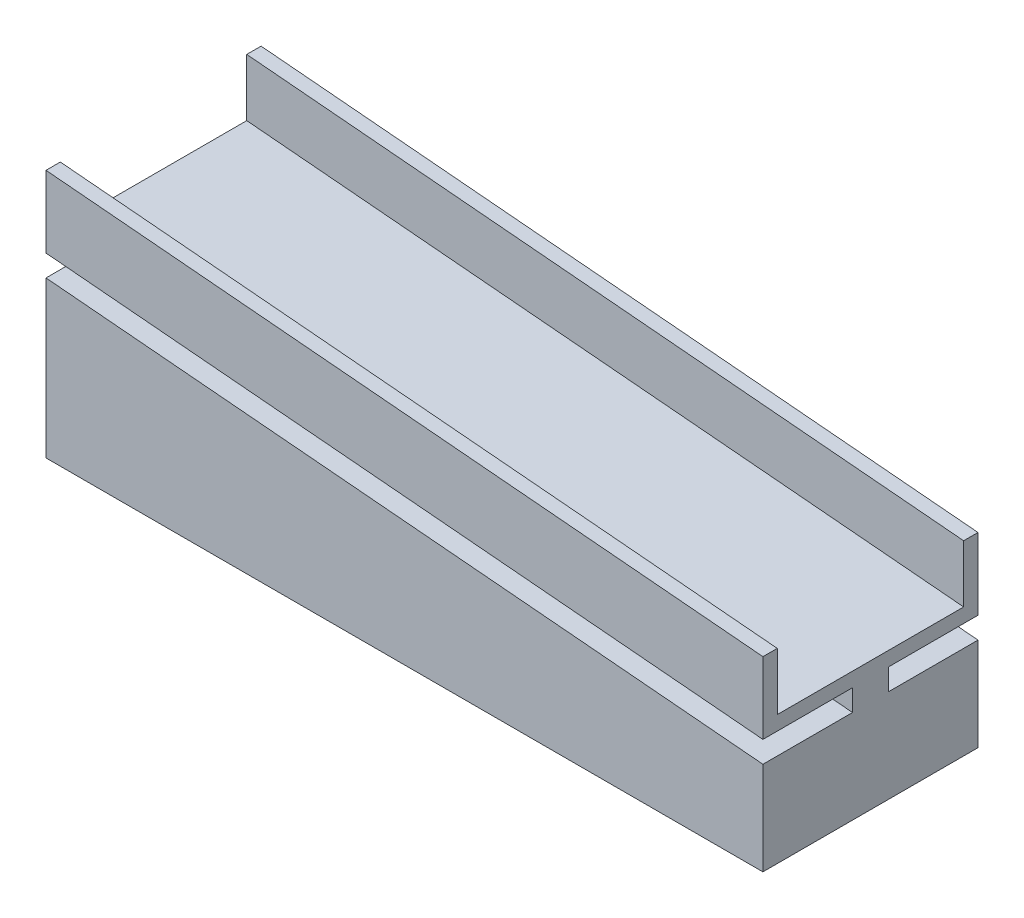
ISO-10303-21;
HEADER;
FILE_DESCRIPTION(('STEP AP214'),'2;1');
FILE_NAME('part.step','',(''),(''),'','','');
FILE_SCHEMA(('AUTOMOTIVE_DESIGN { 1 0 10303 214 1 1 1 1 }'));
ENDSEC;
DATA;
#1=APPLICATION_CONTEXT('core data for automotive mechanical design processes');
#2=APPLICATION_PROTOCOL_DEFINITION('international standard','automotive_design',2000,#1);
#3=PRODUCT_CONTEXT('',#1,'mechanical');
#4=PRODUCT('Part','Part','',(#3));
#5=PRODUCT_RELATED_PRODUCT_CATEGORY('part','',(#4));
#6=PRODUCT_DEFINITION_FORMATION('','',#4);
#7=PRODUCT_DEFINITION_CONTEXT('part definition',#1,'design');
#8=PRODUCT_DEFINITION('design','',#6,#7);
#9=PRODUCT_DEFINITION_SHAPE('','',#8);
#10=(LENGTH_UNIT() NAMED_UNIT(*) SI_UNIT(.MILLI.,.METRE.));
#11=(NAMED_UNIT(*) PLANE_ANGLE_UNIT() SI_UNIT($,.RADIAN.));
#12=(NAMED_UNIT(*) SI_UNIT($,.STERADIAN.) SOLID_ANGLE_UNIT());
#13=UNCERTAINTY_MEASURE_WITH_UNIT(LENGTH_MEASURE(1.E-05),#10,'distance_accuracy_value','');
#14=(GEOMETRIC_REPRESENTATION_CONTEXT(3) GLOBAL_UNCERTAINTY_ASSIGNED_CONTEXT((#13)) GLOBAL_UNIT_ASSIGNED_CONTEXT((#10,
#11,#12)) REPRESENTATION_CONTEXT('',''));
#15=CARTESIAN_POINT('',(0.,0.,0.));
#16=DIRECTION('',(0.,0.,1.));
#17=DIRECTION('',(1.,0.,0.));
#18=AXIS2_PLACEMENT_3D('',#15,#16,#17);
#19=CARTESIAN_POINT('',(0.,21.7488663525917,30.));
#20=DIRECTION('',(-0.0871557427476512,-0.996194698091746,0.));
#21=DIRECTION('',(0.996194698091746,-0.0871557427476512,0.));
#22=AXIS2_PLACEMENT_3D('',#19,#20,#21);
#23=PLANE('',#22);
#24=DIRECTION('',(0.996194698091746,-0.0871557427476512,0.));
#25=VECTOR('',#24,1.);
#26=CARTESIAN_POINT('',(0.,21.7488663525917,12.5));
#27=LINE('',#26,#25);
#28=CARTESIAN_POINT('',(0.,21.7488663525917,12.5));
#29=VERTEX_POINT('',#28);
#30=CARTESIAN_POINT('',(100.,13.,12.5));
#31=VERTEX_POINT('',#30);
#32=EDGE_CURVE('E244',#29,#31,#27,.T.);
#33=ORIENTED_EDGE('',*,*,#32,.T.);
#34=DIRECTION('',(0.,0.,-1.));
#35=VECTOR('',#34,1.);
#36=CARTESIAN_POINT('',(100.,13.,30.));
#37=LINE('',#36,#35);
#38=CARTESIAN_POINT('',(100.,13.,0.));
#39=VERTEX_POINT('',#38);
#40=EDGE_CURVE('E270',#31,#39,#37,.T.);
#41=ORIENTED_EDGE('',*,*,#40,.T.);
#42=DIRECTION('',(-0.996194698091746,0.0871557427476512,0.));
#43=VECTOR('',#42,1.);
#44=CARTESIAN_POINT('',(0.,21.7488663525917,0.));
#45=LINE('',#44,#43);
#46=CARTESIAN_POINT('',(0.,21.7488663525917,0.));
#47=VERTEX_POINT('',#46);
#48=EDGE_CURVE('E263',#39,#47,#45,.T.);
#49=ORIENTED_EDGE('',*,*,#48,.T.);
#50=DIRECTION('',(0.,0.,-1.));
#51=VECTOR('',#50,1.);
#52=CARTESIAN_POINT('',(0.,21.7488663525917,30.));
#53=LINE('',#52,#51);
#54=EDGE_CURVE('E268',#29,#47,#53,.T.);
#55=ORIENTED_EDGE('',*,*,#54,.F.);
#56=EDGE_LOOP('',(#33,#41,#49,#55));
#57=FACE_BOUND('',#56,.T.);
#58=ADVANCED_FACE('F35',(#57),#23,.F.);
#59=CARTESIAN_POINT('',(100.,0.,30.));
#60=DIRECTION('',(0.,1.,0.));
#61=DIRECTION('',(-1.,0.,0.));
#62=AXIS2_PLACEMENT_3D('',#59,#60,#61);
#63=PLANE('',#62);
#64=DIRECTION('',(1.,0.,0.));
#65=VECTOR('',#64,1.);
#66=CARTESIAN_POINT('',(100.,0.,0.));
#67=LINE('',#66,#65);
#68=CARTESIAN_POINT('',(0.,0.,0.));
#69=VERTEX_POINT('',#68);
#70=CARTESIAN_POINT('',(100.,0.,0.));
#71=VERTEX_POINT('',#70);
#72=EDGE_CURVE('E242',#69,#71,#67,.T.);
#73=ORIENTED_EDGE('',*,*,#72,.T.);
#74=DIRECTION('',(0.,0.,-1.));
#75=VECTOR('',#74,1.);
#76=CARTESIAN_POINT('',(100.,0.,30.));
#77=LINE('',#76,#75);
#78=CARTESIAN_POINT('',(100.,0.,30.));
#79=VERTEX_POINT('',#78);
#80=EDGE_CURVE('E11',#79,#71,#77,.T.);
#81=ORIENTED_EDGE('',*,*,#80,.F.);
#82=DIRECTION('',(1.,0.,0.));
#83=VECTOR('',#82,1.);
#84=CARTESIAN_POINT('',(100.,0.,30.));
#85=LINE('',#84,#83);
#86=CARTESIAN_POINT('',(0.,0.,30.));
#87=VERTEX_POINT('',#86);
#88=EDGE_CURVE('E251',#87,#79,#85,.T.);
#89=ORIENTED_EDGE('',*,*,#88,.F.);
#90=DIRECTION('',(0.,0.,-1.));
#91=VECTOR('',#90,1.);
#92=CARTESIAN_POINT('',(0.,0.,30.));
#93=LINE('',#92,#91);
#94=EDGE_CURVE('E257',#87,#69,#93,.T.);
#95=ORIENTED_EDGE('',*,*,#94,.T.);
#96=EDGE_LOOP('',(#73,#81,#89,#95));
#97=FACE_BOUND('',#96,.T.);
#98=ADVANCED_FACE('F37',(#97),#63,.F.);
#99=CARTESIAN_POINT('',(100.,13.,30.));
#100=DIRECTION('',(-1.,0.,0.));
#101=DIRECTION('',(0.,0.,1.));
#102=AXIS2_PLACEMENT_3D('',#99,#100,#101);
#103=PLANE('',#102);
#104=DIRECTION('',(0.,1.,0.));
#105=VECTOR('',#104,1.);
#106=CARTESIAN_POINT('',(100.,13.,0.));
#107=LINE('',#106,#105);
#108=EDGE_CURVE('E260',#71,#39,#107,.T.);
#109=ORIENTED_EDGE('',*,*,#108,.T.);
#110=ORIENTED_EDGE('',*,*,#40,.F.);
#111=DIRECTION('',(0.,1.,0.));
#112=VECTOR('',#111,1.);
#113=CARTESIAN_POINT('',(100.,13.,12.5));
#114=LINE('',#113,#112);
#115=CARTESIAN_POINT('',(100.,16.,12.5));
#116=VERTEX_POINT('',#115);
#117=EDGE_CURVE('E247',#31,#116,#114,.T.);
#118=ORIENTED_EDGE('',*,*,#117,.T.);
#119=DIRECTION('',(0.,0.,1.));
#120=VECTOR('',#119,1.);
#121=CARTESIAN_POINT('',(100.,16.,0.));
#122=LINE('',#121,#120);
#123=CARTESIAN_POINT('',(100.,16.,0.));
#124=VERTEX_POINT('',#123);
#125=EDGE_CURVE('E231',#124,#116,#122,.T.);
#126=ORIENTED_EDGE('',*,*,#125,.F.);
#127=DIRECTION('',(0.,-1.,0.));
#128=VECTOR('',#127,1.);
#129=CARTESIAN_POINT('',(100.,16.,0.));
#130=LINE('',#129,#128);
#131=CARTESIAN_POINT('',(100.,26.,0.));
#132=VERTEX_POINT('',#131);
#133=EDGE_CURVE('E224',#132,#124,#130,.T.);
#134=ORIENTED_EDGE('',*,*,#133,.F.);
#135=DIRECTION('',(0.,0.,-1.));
#136=VECTOR('',#135,1.);
#137=CARTESIAN_POINT('',(100.,26.,0.));
#138=LINE('',#137,#136);
#139=CARTESIAN_POINT('',(100.,26.,2.));
#140=VERTEX_POINT('',#139);
#141=EDGE_CURVE('E217',#140,#132,#138,.T.);
#142=ORIENTED_EDGE('',*,*,#141,.F.);
#143=DIRECTION('',(0.,1.,0.));
#144=VECTOR('',#143,1.);
#145=CARTESIAN_POINT('',(100.,26.,2.));
#146=LINE('',#145,#144);
#147=CARTESIAN_POINT('',(100.,18.,2.));
#148=VERTEX_POINT('',#147);
#149=EDGE_CURVE('E209',#148,#140,#146,.T.);
#150=ORIENTED_EDGE('',*,*,#149,.F.);
#151=DIRECTION('',(0.,0.,-1.));
#152=VECTOR('',#151,1.);
#153=CARTESIAN_POINT('',(100.,18.,2.));
#154=LINE('',#153,#152);
#155=CARTESIAN_POINT('',(100.,18.,28.));
#156=VERTEX_POINT('',#155);
#157=EDGE_CURVE('E201',#156,#148,#154,.T.);
#158=ORIENTED_EDGE('',*,*,#157,.F.);
#159=DIRECTION('',(0.,-1.,0.));
#160=VECTOR('',#159,1.);
#161=CARTESIAN_POINT('',(100.,26.,28.));
#162=LINE('',#161,#160);
#163=CARTESIAN_POINT('',(100.,26.,28.));
#164=VERTEX_POINT('',#163);
#165=EDGE_CURVE('E193',#164,#156,#162,.T.);
#166=ORIENTED_EDGE('',*,*,#165,.F.);
#167=DIRECTION('',(0.,0.,-1.));
#168=VECTOR('',#167,1.);
#169=CARTESIAN_POINT('',(100.,26.,28.));
#170=LINE('',#169,#168);
#171=CARTESIAN_POINT('',(100.,26.,30.));
#172=VERTEX_POINT('',#171);
#173=EDGE_CURVE('E188',#172,#164,#170,.T.);
#174=ORIENTED_EDGE('',*,*,#173,.F.);
#175=DIRECTION('',(0.,1.,0.));
#176=VECTOR('',#175,1.);
#177=CARTESIAN_POINT('',(100.,16.,30.));
#178=LINE('',#177,#176);
#179=CARTESIAN_POINT('',(100.,16.,30.));
#180=VERTEX_POINT('',#179);
#181=EDGE_CURVE('E181',#180,#172,#178,.T.);
#182=ORIENTED_EDGE('',*,*,#181,.F.);
#183=CARTESIAN_POINT('',(100.,16.,17.5));
#184=VERTEX_POINT('',#183);
#185=EDGE_CURVE('E179',#184,#180,#122,.T.);
#186=ORIENTED_EDGE('',*,*,#185,.F.);
#187=DIRECTION('',(0.,1.,0.));
#188=VECTOR('',#187,1.);
#189=CARTESIAN_POINT('',(100.,13.,17.5));
#190=LINE('',#189,#188);
#191=CARTESIAN_POINT('',(100.,13.,17.5));
#192=VERTEX_POINT('',#191);
#193=EDGE_CURVE('E237',#192,#184,#190,.T.);
#194=ORIENTED_EDGE('',*,*,#193,.F.);
#195=CARTESIAN_POINT('',(100.,13.,30.));
#196=VERTEX_POINT('',#195);
#197=EDGE_CURVE('E43',#196,#192,#37,.T.);
#198=ORIENTED_EDGE('',*,*,#197,.F.);
#199=DIRECTION('',(0.,1.,0.));
#200=VECTOR('',#199,1.);
#201=CARTESIAN_POINT('',(100.,13.,30.));
#202=LINE('',#201,#200);
#203=EDGE_CURVE('E84',#79,#196,#202,.T.);
#204=ORIENTED_EDGE('',*,*,#203,.F.);
#205=ORIENTED_EDGE('',*,*,#80,.T.);
#206=EDGE_LOOP('',(#109,#110,#118,#126,#134,#142,#150,#158,#166,#174,#182,#186,#194,#198,#204,#205));
#207=FACE_BOUND('',#206,.T.);
#208=ADVANCED_FACE('F279',(#207),#103,.F.);
#209=ORIENTED_EDGE('',*,*,#197,.T.);
#210=DIRECTION('',(0.996194698091746,-0.0871557427476512,0.));
#211=VECTOR('',#210,1.);
#212=CARTESIAN_POINT('',(0.,21.7488663525917,17.5));
#213=LINE('',#212,#211);
#214=CARTESIAN_POINT('',(0.,21.7488663525917,17.5));
#215=VERTEX_POINT('',#214);
#216=EDGE_CURVE('E234',#215,#192,#213,.T.);
#217=ORIENTED_EDGE('',*,*,#216,.F.);
#218=CARTESIAN_POINT('',(0.,21.7488663525917,30.));
#219=VERTEX_POINT('',#218);
#220=EDGE_CURVE('E269',#219,#215,#53,.T.);
#221=ORIENTED_EDGE('',*,*,#220,.F.);
#222=DIRECTION('',(-0.996194698091746,0.0871557427476512,0.));
#223=VECTOR('',#222,1.);
#224=CARTESIAN_POINT('',(0.,21.7488663525917,30.));
#225=LINE('',#224,#223);
#226=EDGE_CURVE('E254',#196,#219,#225,.T.);
#227=ORIENTED_EDGE('',*,*,#226,.F.);
#228=EDGE_LOOP('',(#209,#217,#221,#227));
#229=FACE_BOUND('',#228,.T.);
#230=ADVANCED_FACE('F287',(#229),#23,.F.);
#231=CARTESIAN_POINT('',(0.,0.,30.));
#232=DIRECTION('',(1.,0.,0.));
#233=DIRECTION('',(0.,1.,0.));
#234=AXIS2_PLACEMENT_3D('',#231,#232,#233);
#235=PLANE('',#234);
#236=DIRECTION('',(0.,-1.,0.));
#237=VECTOR('',#236,1.);
#238=CARTESIAN_POINT('',(0.,0.,0.));
#239=LINE('',#238,#237);
#240=EDGE_CURVE('E77',#47,#69,#239,.T.);
#241=ORIENTED_EDGE('',*,*,#240,.T.);
#242=ORIENTED_EDGE('',*,*,#94,.F.);
#243=DIRECTION('',(0.,-1.,0.));
#244=VECTOR('',#243,1.);
#245=CARTESIAN_POINT('',(0.,0.,30.));
#246=LINE('',#245,#244);
#247=EDGE_CURVE('E59',#219,#87,#246,.T.);
#248=ORIENTED_EDGE('',*,*,#247,.F.);
#249=ORIENTED_EDGE('',*,*,#220,.T.);
#250=DIRECTION('',(0.,-1.,0.));
#251=VECTOR('',#250,1.);
#252=CARTESIAN_POINT('',(0.,24.7488663525917,17.5));
#253=LINE('',#252,#251);
#254=CARTESIAN_POINT('',(0.,24.7488663525917,17.5));
#255=VERTEX_POINT('',#254);
#256=EDGE_CURVE('E162',#255,#215,#253,.T.);
#257=ORIENTED_EDGE('',*,*,#256,.F.);
#258=DIRECTION('',(0.,0.,1.));
#259=VECTOR('',#258,1.);
#260=CARTESIAN_POINT('',(0.,24.7488663525917,0.));
#261=LINE('',#260,#259);
#262=CARTESIAN_POINT('',(0.,24.7488663525917,30.));
#263=VERTEX_POINT('',#262);
#264=EDGE_CURVE('E155',#255,#263,#261,.T.);
#265=ORIENTED_EDGE('',*,*,#264,.T.);
#266=DIRECTION('',(0.,1.,0.));
#267=VECTOR('',#266,1.);
#268=CARTESIAN_POINT('',(0.,24.7488663525917,30.));
#269=LINE('',#268,#267);
#270=CARTESIAN_POINT('',(0.,34.7488663525917,30.));
#271=VERTEX_POINT('',#270);
#272=EDGE_CURVE('E159',#263,#271,#269,.T.);
#273=ORIENTED_EDGE('',*,*,#272,.T.);
#274=DIRECTION('',(0.,0.,-1.));
#275=VECTOR('',#274,1.);
#276=CARTESIAN_POINT('',(0.,34.7488663525917,28.));
#277=LINE('',#276,#275);
#278=CARTESIAN_POINT('',(0.,34.7488663525917,28.));
#279=VERTEX_POINT('',#278);
#280=EDGE_CURVE('E175',#271,#279,#277,.T.);
#281=ORIENTED_EDGE('',*,*,#280,.T.);
#282=DIRECTION('',(0.,-1.,0.));
#283=VECTOR('',#282,1.);
#284=CARTESIAN_POINT('',(0.,34.7488663525917,28.));
#285=LINE('',#284,#283);
#286=CARTESIAN_POINT('',(0.,26.7488663525917,28.));
#287=VERTEX_POINT('',#286);
#288=EDGE_CURVE('E187',#279,#287,#285,.T.);
#289=ORIENTED_EDGE('',*,*,#288,.T.);
#290=DIRECTION('',(0.,0.,-1.));
#291=VECTOR('',#290,1.);
#292=CARTESIAN_POINT('',(0.,26.7488663525917,2.));
#293=LINE('',#292,#291);
#294=CARTESIAN_POINT('',(0.,26.7488663525917,2.));
#295=VERTEX_POINT('',#294);
#296=EDGE_CURVE('E196',#287,#295,#293,.T.);
#297=ORIENTED_EDGE('',*,*,#296,.T.);
#298=DIRECTION('',(0.,1.,0.));
#299=VECTOR('',#298,1.);
#300=CARTESIAN_POINT('',(0.,34.7488663525917,2.));
#301=LINE('',#300,#299);
#302=CARTESIAN_POINT('',(0.,34.7488663525917,2.));
#303=VERTEX_POINT('',#302);
#304=EDGE_CURVE('E204',#295,#303,#301,.T.);
#305=ORIENTED_EDGE('',*,*,#304,.T.);
#306=DIRECTION('',(0.,0.,-1.));
#307=VECTOR('',#306,1.);
#308=CARTESIAN_POINT('',(0.,34.7488663525917,0.));
#309=LINE('',#308,#307);
#310=CARTESIAN_POINT('',(0.,34.7488663525917,0.));
#311=VERTEX_POINT('',#310);
#312=EDGE_CURVE('E212',#303,#311,#309,.T.);
#313=ORIENTED_EDGE('',*,*,#312,.T.);
#314=DIRECTION('',(0.,-1.,0.));
#315=VECTOR('',#314,1.);
#316=CARTESIAN_POINT('',(0.,24.7488663525917,0.));
#317=LINE('',#316,#315);
#318=CARTESIAN_POINT('',(0.,24.7488663525917,0.));
#319=VERTEX_POINT('',#318);
#320=EDGE_CURVE('E167',#311,#319,#317,.T.);
#321=ORIENTED_EDGE('',*,*,#320,.T.);
#322=CARTESIAN_POINT('',(0.,24.7488663525917,12.5));
#323=VERTEX_POINT('',#322);
#324=EDGE_CURVE('E166',#319,#323,#261,.T.);
#325=ORIENTED_EDGE('',*,*,#324,.T.);
#326=DIRECTION('',(0.,-1.,0.));
#327=VECTOR('',#326,1.);
#328=CARTESIAN_POINT('',(0.,24.7488663525917,12.5));
#329=LINE('',#328,#327);
#330=EDGE_CURVE('E50',#323,#29,#329,.T.);
#331=ORIENTED_EDGE('',*,*,#330,.T.);
#332=ORIENTED_EDGE('',*,*,#54,.T.);
#333=EDGE_LOOP('',(#241,#242,#248,#249,#257,#265,#273,#281,#289,#297,#305,#313,#321,#325,#331,#332));
#334=FACE_BOUND('',#333,.T.);
#335=ADVANCED_FACE('F157',(#334),#235,.F.);
#336=CARTESIAN_POINT('',(0.,0.,30.));
#337=DIRECTION('',(0.,0.,-1.));
#338=DIRECTION('',(-1.,0.,0.));
#339=AXIS2_PLACEMENT_3D('',#336,#337,#338);
#340=PLANE('',#339);
#341=ORIENTED_EDGE('',*,*,#88,.T.);
#342=ORIENTED_EDGE('',*,*,#203,.T.);
#343=ORIENTED_EDGE('',*,*,#226,.T.);
#344=ORIENTED_EDGE('',*,*,#247,.T.);
#345=EDGE_LOOP('',(#341,#342,#343,#344));
#346=FACE_BOUND('',#345,.T.);
#347=ADVANCED_FACE('F341',(#346),#340,.F.);
#348=CARTESIAN_POINT('',(0.,0.,0.));
#349=DIRECTION('',(0.,0.,-1.));
#350=DIRECTION('',(-1.,0.,0.));
#351=AXIS2_PLACEMENT_3D('',#348,#349,#350);
#352=PLANE('',#351);
#353=ORIENTED_EDGE('',*,*,#72,.F.);
#354=ORIENTED_EDGE('',*,*,#240,.F.);
#355=ORIENTED_EDGE('',*,*,#48,.F.);
#356=ORIENTED_EDGE('',*,*,#108,.F.);
#357=EDGE_LOOP('',(#353,#354,#355,#356));
#358=FACE_BOUND('',#357,.T.);
#359=ADVANCED_FACE('F283',(#358),#352,.T.);
#360=CARTESIAN_POINT('',(0.,0.,17.5));
#361=DIRECTION('',(0.,0.,1.));
#362=DIRECTION('',(1.,0.,0.));
#363=AXIS2_PLACEMENT_3D('',#360,#361,#362);
#364=PLANE('',#363);
#365=ORIENTED_EDGE('',*,*,#256,.T.);
#366=ORIENTED_EDGE('',*,*,#216,.T.);
#367=ORIENTED_EDGE('',*,*,#193,.T.);
#368=DIRECTION('',(-0.996194698091746,0.0871557427476511,0.));
#369=VECTOR('',#368,1.);
#370=CARTESIAN_POINT('',(100.,16.,17.5));
#371=LINE('',#370,#369);
#372=EDGE_CURVE('E240',#184,#255,#371,.T.);
#373=ORIENTED_EDGE('',*,*,#372,.T.);
#374=EDGE_LOOP('',(#365,#366,#367,#373));
#375=FACE_BOUND('',#374,.T.);
#376=ADVANCED_FACE('F290',(#375),#364,.T.);
#377=CARTESIAN_POINT('',(0.,0.,12.5));
#378=DIRECTION('',(0.,0.,1.));
#379=DIRECTION('',(1.,0.,0.));
#380=AXIS2_PLACEMENT_3D('',#377,#378,#379);
#381=PLANE('',#380);
#382=ORIENTED_EDGE('',*,*,#330,.F.);
#383=DIRECTION('',(-0.996194698091746,0.0871557427476511,0.));
#384=VECTOR('',#383,1.);
#385=CARTESIAN_POINT('',(100.,16.,12.5));
#386=LINE('',#385,#384);
#387=EDGE_CURVE('E235',#116,#323,#386,.T.);
#388=ORIENTED_EDGE('',*,*,#387,.F.);
#389=ORIENTED_EDGE('',*,*,#117,.F.);
#390=ORIENTED_EDGE('',*,*,#32,.F.);
#391=EDGE_LOOP('',(#382,#388,#389,#390));
#392=FACE_BOUND('',#391,.T.);
#393=ADVANCED_FACE('F320',(#392),#381,.F.);
#394=CARTESIAN_POINT('',(0.,24.7488663525917,0.));
#395=DIRECTION('',(0.0871557427476511,0.996194698091746,0.));
#396=DIRECTION('',(-0.996194698091746,0.0871557427476511,0.));
#397=AXIS2_PLACEMENT_3D('',#394,#395,#396);
#398=PLANE('',#397);
#399=ORIENTED_EDGE('',*,*,#125,.T.);
#400=ORIENTED_EDGE('',*,*,#387,.T.);
#401=ORIENTED_EDGE('',*,*,#324,.F.);
#402=DIRECTION('',(0.996194698091746,-0.0871557427476511,0.));
#403=VECTOR('',#402,1.);
#404=CARTESIAN_POINT('',(0.,24.7488663525917,0.));
#405=LINE('',#404,#403);
#406=EDGE_CURVE('E228',#319,#124,#405,.T.);
#407=ORIENTED_EDGE('',*,*,#406,.T.);
#408=EDGE_LOOP('',(#399,#400,#401,#407));
#409=FACE_BOUND('',#408,.T.);
#410=ADVANCED_FACE('F317',(#409),#398,.F.);
#411=CARTESIAN_POINT('',(0.,24.7488663525917,30.));
#412=DIRECTION('',(0.,0.,-1.));
#413=DIRECTION('',(-1.,0.,0.));
#414=AXIS2_PLACEMENT_3D('',#411,#412,#413);
#415=PLANE('',#414);
#416=DIRECTION('',(0.996194698091746,-0.0871557427476511,0.));
#417=VECTOR('',#416,1.);
#418=CARTESIAN_POINT('',(0.,34.7488663525917,30.));
#419=LINE('',#418,#417);
#420=EDGE_CURVE('E174',#271,#172,#419,.T.);
#421=ORIENTED_EDGE('',*,*,#420,.F.);
#422=ORIENTED_EDGE('',*,*,#272,.F.);
#423=DIRECTION('',(0.996194698091746,-0.0871557427476511,0.));
#424=VECTOR('',#423,1.);
#425=CARTESIAN_POINT('',(0.,24.7488663525917,30.));
#426=LINE('',#425,#424);
#427=EDGE_CURVE('E172',#263,#180,#426,.T.);
#428=ORIENTED_EDGE('',*,*,#427,.T.);
#429=ORIENTED_EDGE('',*,*,#181,.T.);
#430=EDGE_LOOP('',(#421,#422,#428,#429));
#431=FACE_BOUND('',#430,.T.);
#432=ADVANCED_FACE('F171',(#431),#415,.F.);
#433=CARTESIAN_POINT('',(0.,34.7488663525917,28.));
#434=DIRECTION('',(-0.0871557427476511,-0.996194698091746,0.));
#435=DIRECTION('',(0.996194698091746,-0.0871557427476511,0.));
#436=AXIS2_PLACEMENT_3D('',#433,#434,#435);
#437=PLANE('',#436);
#438=DIRECTION('',(0.996194698091746,-0.0871557427476511,0.));
#439=VECTOR('',#438,1.);
#440=CARTESIAN_POINT('',(0.,34.7488663525917,28.));
#441=LINE('',#440,#439);
#442=EDGE_CURVE('E190',#279,#164,#441,.T.);
#443=ORIENTED_EDGE('',*,*,#442,.F.);
#444=ORIENTED_EDGE('',*,*,#280,.F.);
#445=ORIENTED_EDGE('',*,*,#420,.T.);
#446=ORIENTED_EDGE('',*,*,#173,.T.);
#447=EDGE_LOOP('',(#443,#444,#445,#446));
#448=FACE_BOUND('',#447,.T.);
#449=ADVANCED_FACE('F296',(#448),#437,.F.);
#450=CARTESIAN_POINT('',(0.,34.7488663525917,28.));
#451=DIRECTION('',(0.,0.,1.));
#452=DIRECTION('',(1.,0.,0.));
#453=AXIS2_PLACEMENT_3D('',#450,#451,#452);
#454=PLANE('',#453);
#455=DIRECTION('',(0.996194698091746,-0.0871557427476511,0.));
#456=VECTOR('',#455,1.);
#457=CARTESIAN_POINT('',(0.,26.7488663525917,28.));
#458=LINE('',#457,#456);
#459=EDGE_CURVE('E198',#287,#156,#458,.T.);
#460=ORIENTED_EDGE('',*,*,#459,.F.);
#461=ORIENTED_EDGE('',*,*,#288,.F.);
#462=ORIENTED_EDGE('',*,*,#442,.T.);
#463=ORIENTED_EDGE('',*,*,#165,.T.);
#464=EDGE_LOOP('',(#460,#461,#462,#463));
#465=FACE_BOUND('',#464,.T.);
#466=ADVANCED_FACE('F300',(#465),#454,.F.);
#467=CARTESIAN_POINT('',(0.,26.7488663525917,2.));
#468=DIRECTION('',(-0.0871557427476511,-0.996194698091746,0.));
#469=DIRECTION('',(0.996194698091746,-0.0871557427476511,0.));
#470=AXIS2_PLACEMENT_3D('',#467,#468,#469);
#471=PLANE('',#470);
#472=DIRECTION('',(0.996194698091746,-0.0871557427476511,0.));
#473=VECTOR('',#472,1.);
#474=CARTESIAN_POINT('',(0.,26.7488663525917,2.));
#475=LINE('',#474,#473);
#476=EDGE_CURVE('E206',#295,#148,#475,.T.);
#477=ORIENTED_EDGE('',*,*,#476,.F.);
#478=ORIENTED_EDGE('',*,*,#296,.F.);
#479=ORIENTED_EDGE('',*,*,#459,.T.);
#480=ORIENTED_EDGE('',*,*,#157,.T.);
#481=EDGE_LOOP('',(#477,#478,#479,#480));
#482=FACE_BOUND('',#481,.T.);
#483=ADVANCED_FACE('F302',(#482),#471,.F.);
#484=CARTESIAN_POINT('',(0.,34.7488663525917,2.));
#485=DIRECTION('',(0.,0.,-1.));
#486=DIRECTION('',(0.,1.,0.));
#487=AXIS2_PLACEMENT_3D('',#484,#485,#486);
#488=PLANE('',#487);
#489=DIRECTION('',(0.996194698091746,-0.0871557427476511,0.));
#490=VECTOR('',#489,1.);
#491=CARTESIAN_POINT('',(0.,34.7488663525917,2.));
#492=LINE('',#491,#490);
#493=EDGE_CURVE('E214',#303,#140,#492,.T.);
#494=ORIENTED_EDGE('',*,*,#493,.F.);
#495=ORIENTED_EDGE('',*,*,#304,.F.);
#496=ORIENTED_EDGE('',*,*,#476,.T.);
#497=ORIENTED_EDGE('',*,*,#149,.T.);
#498=EDGE_LOOP('',(#494,#495,#496,#497));
#499=FACE_BOUND('',#498,.T.);
#500=ADVANCED_FACE('F306',(#499),#488,.F.);
#501=CARTESIAN_POINT('',(0.,34.7488663525917,0.));
#502=DIRECTION('',(-0.0871557427476511,-0.996194698091746,0.));
#503=DIRECTION('',(0.996194698091746,-0.0871557427476511,0.));
#504=AXIS2_PLACEMENT_3D('',#501,#502,#503);
#505=PLANE('',#504);
#506=DIRECTION('',(0.996194698091746,-0.0871557427476511,0.));
#507=VECTOR('',#506,1.);
#508=CARTESIAN_POINT('',(0.,34.7488663525917,0.));
#509=LINE('',#508,#507);
#510=EDGE_CURVE('E221',#311,#132,#509,.T.);
#511=ORIENTED_EDGE('',*,*,#510,.F.);
#512=ORIENTED_EDGE('',*,*,#312,.F.);
#513=ORIENTED_EDGE('',*,*,#493,.T.);
#514=ORIENTED_EDGE('',*,*,#141,.T.);
#515=EDGE_LOOP('',(#511,#512,#513,#514));
#516=FACE_BOUND('',#515,.T.);
#517=ADVANCED_FACE('F311',(#516),#505,.F.);
#518=CARTESIAN_POINT('',(0.,24.7488663525917,0.));
#519=DIRECTION('',(0.,0.,1.));
#520=DIRECTION('',(1.,0.,0.));
#521=AXIS2_PLACEMENT_3D('',#518,#519,#520);
#522=PLANE('',#521);
#523=ORIENTED_EDGE('',*,*,#406,.F.);
#524=ORIENTED_EDGE('',*,*,#320,.F.);
#525=ORIENTED_EDGE('',*,*,#510,.T.);
#526=ORIENTED_EDGE('',*,*,#133,.T.);
#527=EDGE_LOOP('',(#523,#524,#525,#526));
#528=FACE_BOUND('',#527,.T.);
#529=ADVANCED_FACE('F314',(#528),#522,.F.);
#530=ORIENTED_EDGE('',*,*,#372,.F.);
#531=ORIENTED_EDGE('',*,*,#185,.T.);
#532=ORIENTED_EDGE('',*,*,#427,.F.);
#533=ORIENTED_EDGE('',*,*,#264,.F.);
#534=EDGE_LOOP('',(#530,#531,#532,#533));
#535=FACE_BOUND('',#534,.T.);
#536=ADVANCED_FACE('F177',(#535),#398,.F.);
#537=CLOSED_SHELL('',(#58,#98,#208,#230,#335,#347,#359,#376,#393,#410,#432,#449,#466,#483,#500,
#517,#529,#536));
#538=MANIFOLD_SOLID_BREP('B2',#537);
#539=ADVANCED_BREP_SHAPE_REPRESENTATION('',(#18,#538),#14);
#540=SHAPE_DEFINITION_REPRESENTATION(#9,#539);
ENDSEC;
END-ISO-10303-21;
